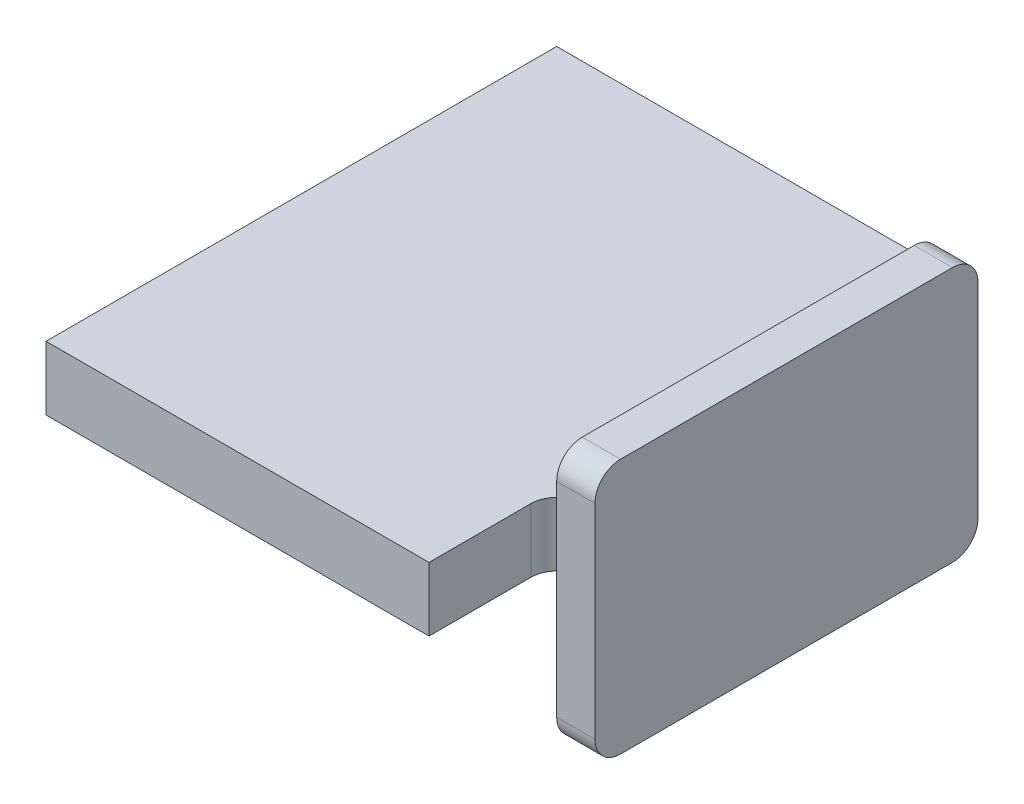
ISO-10303-21;
HEADER;
FILE_DESCRIPTION(('STEP AP214'),'2;1');
FILE_NAME('part.step','',(''),(''),'','','');
FILE_SCHEMA(('AUTOMOTIVE_DESIGN { 1 0 10303 214 1 1 1 1 }'));
ENDSEC;
DATA;
#1=APPLICATION_CONTEXT('core data for automotive mechanical design processes');
#2=APPLICATION_PROTOCOL_DEFINITION('international standard','automotive_design',2000,#1);
#3=PRODUCT_CONTEXT('',#1,'mechanical');
#4=PRODUCT('Part','Part','',(#3));
#5=PRODUCT_RELATED_PRODUCT_CATEGORY('part','',(#4));
#6=PRODUCT_DEFINITION_FORMATION('','',#4);
#7=PRODUCT_DEFINITION_CONTEXT('part definition',#1,'design');
#8=PRODUCT_DEFINITION('design','',#6,#7);
#9=PRODUCT_DEFINITION_SHAPE('','',#8);
#10=(LENGTH_UNIT() NAMED_UNIT(*) SI_UNIT(.MILLI.,.METRE.));
#11=(NAMED_UNIT(*) PLANE_ANGLE_UNIT() SI_UNIT($,.RADIAN.));
#12=(NAMED_UNIT(*) SI_UNIT($,.STERADIAN.) SOLID_ANGLE_UNIT());
#13=UNCERTAINTY_MEASURE_WITH_UNIT(LENGTH_MEASURE(1.E-05),#10,'distance_accuracy_value','');
#14=(GEOMETRIC_REPRESENTATION_CONTEXT(3) GLOBAL_UNCERTAINTY_ASSIGNED_CONTEXT((#13)) GLOBAL_UNIT_ASSIGNED_CONTEXT((#10,
#11,#12)) REPRESENTATION_CONTEXT('',''));
#15=CARTESIAN_POINT('',(0.,0.,0.));
#16=DIRECTION('',(0.,0.,1.));
#17=DIRECTION('',(1.,0.,0.));
#18=AXIS2_PLACEMENT_3D('',#15,#16,#17);
#19=CARTESIAN_POINT('',(-3.,2.5,12.));
#20=DIRECTION('',(0.,-1.,0.));
#21=DIRECTION('',(0.,0.,-1.));
#22=AXIS2_PLACEMENT_3D('',#19,#20,#21);
#23=CYLINDRICAL_SURFACE('',#22,2.);
#24=DIRECTION('',(0.,-1.,0.));
#25=VECTOR('',#24,1.);
#26=CARTESIAN_POINT('',(-3.,2.5,10.));
#27=LINE('',#26,#25);
#28=CARTESIAN_POINT('',(-3.,2.5,10.));
#29=VERTEX_POINT('',#28);
#30=CARTESIAN_POINT('',(-3.,-2.5,10.));
#31=VERTEX_POINT('',#30);
#32=EDGE_CURVE('E280',#29,#31,#27,.T.);
#33=ORIENTED_EDGE('',*,*,#32,.F.);
#34=CARTESIAN_POINT('',(-3.,2.5,12.));
#35=DIRECTION('',(0.,1.,0.));
#36=DIRECTION('',(0.,0.,1.));
#37=AXIS2_PLACEMENT_3D('',#34,#35,#36);
#38=CIRCLE('',#37,2.);
#39=CARTESIAN_POINT('',(-5.,2.5,12.));
#40=VERTEX_POINT('',#39);
#41=EDGE_CURVE('E42',#29,#40,#38,.T.);
#42=ORIENTED_EDGE('',*,*,#41,.T.);
#43=DIRECTION('',(0.,-1.,0.));
#44=VECTOR('',#43,1.);
#45=CARTESIAN_POINT('',(-5.,2.5,12.));
#46=LINE('',#45,#44);
#47=CARTESIAN_POINT('',(-5.,-2.5,12.));
#48=VERTEX_POINT('',#47);
#49=EDGE_CURVE('E283',#48,#40,#46,.F.);
#50=ORIENTED_EDGE('',*,*,#49,.F.);
#51=CARTESIAN_POINT('',(-3.,-2.5,12.));
#52=DIRECTION('',(0.,-1.,0.));
#53=DIRECTION('',(0.,0.,-1.));
#54=AXIS2_PLACEMENT_3D('',#51,#52,#53);
#55=CIRCLE('',#54,2.);
#56=EDGE_CURVE('E11',#48,#31,#55,.T.);
#57=ORIENTED_EDGE('',*,*,#56,.T.);
#58=EDGE_LOOP('',(#33,#42,#50,#57));
#59=FACE_BOUND('',#58,.T.);
#60=ADVANCED_FACE('F35',(#59),#23,.F.);
#61=CARTESIAN_POINT('',(-3.,2.5,-12.));
#62=DIRECTION('',(0.,-1.,0.));
#63=DIRECTION('',(0.,0.,-1.));
#64=AXIS2_PLACEMENT_3D('',#61,#62,#63);
#65=CYLINDRICAL_SURFACE('',#64,2.);
#66=DIRECTION('',(0.,-1.,0.));
#67=VECTOR('',#66,1.);
#68=CARTESIAN_POINT('',(-5.,2.5,-12.));
#69=LINE('',#68,#67);
#70=CARTESIAN_POINT('',(-5.,2.5,-12.));
#71=VERTEX_POINT('',#70);
#72=CARTESIAN_POINT('',(-5.,-2.5,-12.));
#73=VERTEX_POINT('',#72);
#74=EDGE_CURVE('E270',#71,#73,#69,.T.);
#75=ORIENTED_EDGE('',*,*,#74,.F.);
#76=CARTESIAN_POINT('',(-3.,2.5,-12.));
#77=DIRECTION('',(0.,1.,0.));
#78=DIRECTION('',(0.,0.,1.));
#79=AXIS2_PLACEMENT_3D('',#76,#77,#78);
#80=CIRCLE('',#79,2.);
#81=CARTESIAN_POINT('',(-3.,2.5,-10.));
#82=VERTEX_POINT('',#81);
#83=EDGE_CURVE('E276',#71,#82,#80,.T.);
#84=ORIENTED_EDGE('',*,*,#83,.T.);
#85=DIRECTION('',(0.,-1.,0.));
#86=VECTOR('',#85,1.);
#87=CARTESIAN_POINT('',(-3.,2.5,-10.));
#88=LINE('',#87,#86);
#89=CARTESIAN_POINT('',(-3.,-2.5,-10.));
#90=VERTEX_POINT('',#89);
#91=EDGE_CURVE('E273',#90,#82,#88,.F.);
#92=ORIENTED_EDGE('',*,*,#91,.F.);
#93=CARTESIAN_POINT('',(-3.,-2.5,-12.));
#94=DIRECTION('',(0.,-1.,0.));
#95=DIRECTION('',(0.,0.,-1.));
#96=AXIS2_PLACEMENT_3D('',#93,#94,#95);
#97=CIRCLE('',#96,2.);
#98=EDGE_CURVE('E278',#90,#73,#97,.T.);
#99=ORIENTED_EDGE('',*,*,#98,.T.);
#100=EDGE_LOOP('',(#75,#84,#92,#99));
#101=FACE_BOUND('',#100,.T.);
#102=ADVANCED_FACE('F312',(#101),#65,.F.);
#103=CARTESIAN_POINT('',(-35.,2.5,-10.));
#104=DIRECTION('',(0.,0.,-1.));
#105=DIRECTION('',(-1.,0.,0.));
#106=AXIS2_PLACEMENT_3D('',#103,#104,#105);
#107=PLANE('',#106);
#108=DIRECTION('',(1.,0.,0.));
#109=VECTOR('',#108,1.);
#110=CARTESIAN_POINT('',(-35.,-2.5,-10.));
#111=LINE('',#110,#109);
#112=CARTESIAN_POINT('',(0.,-2.5,-10.));
#113=VERTEX_POINT('',#112);
#114=EDGE_CURVE('E221',#90,#113,#111,.T.);
#115=ORIENTED_EDGE('',*,*,#114,.F.);
#116=ORIENTED_EDGE('',*,*,#91,.T.);
#117=DIRECTION('',(1.,0.,0.));
#118=VECTOR('',#117,1.);
#119=CARTESIAN_POINT('',(-35.,2.5,-10.));
#120=LINE('',#119,#118);
#121=CARTESIAN_POINT('',(0.,2.5,-10.));
#122=VERTEX_POINT('',#121);
#123=EDGE_CURVE('E210',#82,#122,#120,.T.);
#124=ORIENTED_EDGE('',*,*,#123,.T.);
#125=DIRECTION('',(0.,1.,0.));
#126=VECTOR('',#125,1.);
#127=CARTESIAN_POINT('',(0.,2.5,-10.));
#128=LINE('',#127,#126);
#129=EDGE_CURVE('E201',#113,#122,#128,.T.);
#130=ORIENTED_EDGE('',*,*,#129,.F.);
#131=EDGE_LOOP('',(#115,#116,#124,#130));
#132=FACE_BOUND('',#131,.T.);
#133=ADVANCED_FACE('F317',(#132),#107,.T.);
#134=CARTESIAN_POINT('',(-35.,2.5,10.));
#135=DIRECTION('',(0.,0.,1.));
#136=DIRECTION('',(1.,0.,0.));
#137=AXIS2_PLACEMENT_3D('',#134,#135,#136);
#138=PLANE('',#137);
#139=DIRECTION('',(1.,0.,0.));
#140=VECTOR('',#139,1.);
#141=CARTESIAN_POINT('',(-35.,2.5,10.));
#142=LINE('',#141,#140);
#143=CARTESIAN_POINT('',(0.,2.5,10.));
#144=VERTEX_POINT('',#143);
#145=EDGE_CURVE('E226',#29,#144,#142,.T.);
#146=ORIENTED_EDGE('',*,*,#145,.F.);
#147=ORIENTED_EDGE('',*,*,#32,.T.);
#148=DIRECTION('',(1.,0.,0.));
#149=VECTOR('',#148,1.);
#150=CARTESIAN_POINT('',(-35.,-2.5,10.));
#151=LINE('',#150,#149);
#152=CARTESIAN_POINT('',(0.,-2.5,10.));
#153=VERTEX_POINT('',#152);
#154=EDGE_CURVE('E224',#31,#153,#151,.T.);
#155=ORIENTED_EDGE('',*,*,#154,.T.);
#156=DIRECTION('',(0.,-1.,0.));
#157=VECTOR('',#156,1.);
#158=CARTESIAN_POINT('',(0.,2.5,10.));
#159=LINE('',#158,#157);
#160=EDGE_CURVE('E216',#144,#153,#159,.T.);
#161=ORIENTED_EDGE('',*,*,#160,.F.);
#162=EDGE_LOOP('',(#146,#147,#155,#161));
#163=FACE_BOUND('',#162,.T.);
#164=ADVANCED_FACE('F326',(#163),#138,.T.);
#165=CARTESIAN_POINT('',(3.,-8.,13.));
#166=DIRECTION('',(1.,0.,0.));
#167=DIRECTION('',(0.,0.,-1.));
#168=AXIS2_PLACEMENT_3D('',#165,#166,#167);
#169=CYLINDRICAL_SURFACE('',#168,2.);
#170=DIRECTION('',(1.,0.,0.));
#171=VECTOR('',#170,1.);
#172=CARTESIAN_POINT('',(3.,-8.,15.));
#173=LINE('',#172,#171);
#174=CARTESIAN_POINT('',(0.,-8.,15.));
#175=VERTEX_POINT('',#174);
#176=CARTESIAN_POINT('',(3.,-8.,15.));
#177=VERTEX_POINT('',#176);
#178=EDGE_CURVE('E260',#175,#177,#173,.T.);
#179=ORIENTED_EDGE('',*,*,#178,.F.);
#180=CARTESIAN_POINT('',(0.,-8.,13.));
#181=DIRECTION('',(1.,0.,0.));
#182=DIRECTION('',(0.,0.,-1.));
#183=AXIS2_PLACEMENT_3D('',#180,#181,#182);
#184=CIRCLE('',#183,2.);
#185=CARTESIAN_POINT('',(0.,-10.,13.));
#186=VERTEX_POINT('',#185);
#187=EDGE_CURVE('E266',#186,#175,#184,.F.);
#188=ORIENTED_EDGE('',*,*,#187,.F.);
#189=DIRECTION('',(1.,0.,0.));
#190=VECTOR('',#189,1.);
#191=CARTESIAN_POINT('',(3.,-10.,13.));
#192=LINE('',#191,#190);
#193=CARTESIAN_POINT('',(3.,-10.,13.));
#194=VERTEX_POINT('',#193);
#195=EDGE_CURVE('E263',#194,#186,#192,.F.);
#196=ORIENTED_EDGE('',*,*,#195,.F.);
#197=CARTESIAN_POINT('',(3.,-8.,13.));
#198=DIRECTION('',(1.,0.,0.));
#199=DIRECTION('',(0.,0.,-1.));
#200=AXIS2_PLACEMENT_3D('',#197,#198,#199);
#201=CIRCLE('',#200,2.);
#202=EDGE_CURVE('E268',#177,#194,#201,.T.);
#203=ORIENTED_EDGE('',*,*,#202,.F.);
#204=EDGE_LOOP('',(#179,#188,#196,#203));
#205=FACE_BOUND('',#204,.T.);
#206=ADVANCED_FACE('F336',(#205),#169,.T.);
#207=CARTESIAN_POINT('',(3.,-8.,-13.));
#208=DIRECTION('',(1.,0.,0.));
#209=DIRECTION('',(0.,0.,-1.));
#210=AXIS2_PLACEMENT_3D('',#207,#208,#209);
#211=CYLINDRICAL_SURFACE('',#210,2.);
#212=DIRECTION('',(1.,0.,0.));
#213=VECTOR('',#212,1.);
#214=CARTESIAN_POINT('',(3.,-10.,-13.));
#215=LINE('',#214,#213);
#216=CARTESIAN_POINT('',(0.,-10.,-13.));
#217=VERTEX_POINT('',#216);
#218=CARTESIAN_POINT('',(3.,-10.,-13.));
#219=VERTEX_POINT('',#218);
#220=EDGE_CURVE('E249',#217,#219,#215,.T.);
#221=ORIENTED_EDGE('',*,*,#220,.F.);
#222=CARTESIAN_POINT('',(0.,-8.,-13.));
#223=DIRECTION('',(1.,0.,0.));
#224=DIRECTION('',(0.,0.,-1.));
#225=AXIS2_PLACEMENT_3D('',#222,#223,#224);
#226=CIRCLE('',#225,2.);
#227=CARTESIAN_POINT('',(0.,-8.,-15.));
#228=VERTEX_POINT('',#227);
#229=EDGE_CURVE('E255',#228,#217,#226,.F.);
#230=ORIENTED_EDGE('',*,*,#229,.F.);
#231=DIRECTION('',(1.,0.,0.));
#232=VECTOR('',#231,1.);
#233=CARTESIAN_POINT('',(3.,-8.,-15.));
#234=LINE('',#233,#232);
#235=CARTESIAN_POINT('',(3.,-8.,-15.));
#236=VERTEX_POINT('',#235);
#237=EDGE_CURVE('E252',#236,#228,#234,.F.);
#238=ORIENTED_EDGE('',*,*,#237,.F.);
#239=CARTESIAN_POINT('',(3.,-8.,-13.));
#240=DIRECTION('',(1.,0.,0.));
#241=DIRECTION('',(0.,0.,-1.));
#242=AXIS2_PLACEMENT_3D('',#239,#240,#241);
#243=CIRCLE('',#242,2.);
#244=EDGE_CURVE('E258',#219,#236,#243,.T.);
#245=ORIENTED_EDGE('',*,*,#244,.F.);
#246=EDGE_LOOP('',(#221,#230,#238,#245));
#247=FACE_BOUND('',#246,.T.);
#248=ADVANCED_FACE('F339',(#247),#211,.T.);
#249=CARTESIAN_POINT('',(3.,8.,13.));
#250=DIRECTION('',(-1.,0.,0.));
#251=DIRECTION('',(0.,0.,1.));
#252=AXIS2_PLACEMENT_3D('',#249,#250,#251);
#253=CYLINDRICAL_SURFACE('',#252,2.);
#254=DIRECTION('',(-1.,0.,0.));
#255=VECTOR('',#254,1.);
#256=CARTESIAN_POINT('',(3.,8.,15.));
#257=LINE('',#256,#255);
#258=CARTESIAN_POINT('',(3.,8.,15.));
#259=VERTEX_POINT('',#258);
#260=CARTESIAN_POINT('',(0.,8.,15.));
#261=VERTEX_POINT('',#260);
#262=EDGE_CURVE('E239',#259,#261,#257,.T.);
#263=ORIENTED_EDGE('',*,*,#262,.F.);
#264=CARTESIAN_POINT('',(3.,8.,13.));
#265=DIRECTION('',(1.,0.,0.));
#266=DIRECTION('',(0.,0.,-1.));
#267=AXIS2_PLACEMENT_3D('',#264,#265,#266);
#268=CIRCLE('',#267,2.);
#269=CARTESIAN_POINT('',(3.,10.,13.));
#270=VERTEX_POINT('',#269);
#271=EDGE_CURVE('E245',#270,#259,#268,.T.);
#272=ORIENTED_EDGE('',*,*,#271,.F.);
#273=DIRECTION('',(-1.,0.,0.));
#274=VECTOR('',#273,1.);
#275=CARTESIAN_POINT('',(3.,10.,13.));
#276=LINE('',#275,#274);
#277=CARTESIAN_POINT('',(0.,10.,13.));
#278=VERTEX_POINT('',#277);
#279=EDGE_CURVE('E242',#278,#270,#276,.F.);
#280=ORIENTED_EDGE('',*,*,#279,.F.);
#281=CARTESIAN_POINT('',(0.,8.,13.));
#282=DIRECTION('',(1.,0.,0.));
#283=DIRECTION('',(0.,0.,-1.));
#284=AXIS2_PLACEMENT_3D('',#281,#282,#283);
#285=CIRCLE('',#284,2.);
#286=EDGE_CURVE('E247',#261,#278,#285,.F.);
#287=ORIENTED_EDGE('',*,*,#286,.F.);
#288=EDGE_LOOP('',(#263,#272,#280,#287));
#289=FACE_BOUND('',#288,.T.);
#290=ADVANCED_FACE('F343',(#289),#253,.T.);
#291=CARTESIAN_POINT('',(3.,8.,-13.));
#292=DIRECTION('',(1.,0.,0.));
#293=DIRECTION('',(0.,0.,-1.));
#294=AXIS2_PLACEMENT_3D('',#291,#292,#293);
#295=CYLINDRICAL_SURFACE('',#294,2.);
#296=DIRECTION('',(1.,0.,0.));
#297=VECTOR('',#296,1.);
#298=CARTESIAN_POINT('',(3.,8.,-15.));
#299=LINE('',#298,#297);
#300=CARTESIAN_POINT('',(0.,8.,-15.));
#301=VERTEX_POINT('',#300);
#302=CARTESIAN_POINT('',(3.,8.,-15.));
#303=VERTEX_POINT('',#302);
#304=EDGE_CURVE('E223',#301,#303,#299,.T.);
#305=ORIENTED_EDGE('',*,*,#304,.F.);
#306=CARTESIAN_POINT('',(0.,8.,-13.));
#307=DIRECTION('',(1.,0.,0.));
#308=DIRECTION('',(0.,0.,-1.));
#309=AXIS2_PLACEMENT_3D('',#306,#307,#308);
#310=CIRCLE('',#309,2.);
#311=CARTESIAN_POINT('',(0.,10.,-13.));
#312=VERTEX_POINT('',#311);
#313=EDGE_CURVE('E234',#312,#301,#310,.F.);
#314=ORIENTED_EDGE('',*,*,#313,.F.);
#315=DIRECTION('',(1.,0.,0.));
#316=VECTOR('',#315,1.);
#317=CARTESIAN_POINT('',(3.,10.,-13.));
#318=LINE('',#317,#316);
#319=CARTESIAN_POINT('',(3.,10.,-13.));
#320=VERTEX_POINT('',#319);
#321=EDGE_CURVE('E231',#320,#312,#318,.F.);
#322=ORIENTED_EDGE('',*,*,#321,.F.);
#323=CARTESIAN_POINT('',(3.,8.,-13.));
#324=DIRECTION('',(1.,0.,0.));
#325=DIRECTION('',(0.,0.,-1.));
#326=AXIS2_PLACEMENT_3D('',#323,#324,#325);
#327=CIRCLE('',#326,2.);
#328=EDGE_CURVE('E237',#303,#320,#327,.T.);
#329=ORIENTED_EDGE('',*,*,#328,.F.);
#330=EDGE_LOOP('',(#305,#314,#322,#329));
#331=FACE_BOUND('',#330,.T.);
#332=ADVANCED_FACE('F347',(#331),#295,.T.);
#333=CARTESIAN_POINT('',(-35.,-2.5,10.));
#334=DIRECTION('',(0.,-1.,0.));
#335=DIRECTION('',(0.,0.,-1.));
#336=AXIS2_PLACEMENT_3D('',#333,#334,#335);
#337=PLANE('',#336);
#338=ORIENTED_EDGE('',*,*,#98,.F.);
#339=ORIENTED_EDGE('',*,*,#114,.T.);
#340=DIRECTION('',(0.,0.,-1.));
#341=VECTOR('',#340,1.);
#342=CARTESIAN_POINT('',(0.,-2.5,10.));
#343=LINE('',#342,#341);
#344=EDGE_CURVE('E169',#153,#113,#343,.T.);
#345=ORIENTED_EDGE('',*,*,#344,.F.);
#346=ORIENTED_EDGE('',*,*,#154,.F.);
#347=ORIENTED_EDGE('',*,*,#56,.F.);
#348=DIRECTION('',(0.,0.,-1.));
#349=VECTOR('',#348,1.);
#350=CARTESIAN_POINT('',(-5.,-2.5,-20.));
#351=LINE('',#350,#349);
#352=CARTESIAN_POINT('',(-5.,-2.5,20.));
#353=VERTEX_POINT('',#352);
#354=EDGE_CURVE('E288',#353,#48,#351,.T.);
#355=ORIENTED_EDGE('',*,*,#354,.F.);
#356=DIRECTION('',(1.,0.,0.));
#357=VECTOR('',#356,1.);
#358=CARTESIAN_POINT('',(-35.,-2.5,20.));
#359=LINE('',#358,#357);
#360=CARTESIAN_POINT('',(-35.,-2.5,20.));
#361=VERTEX_POINT('',#360);
#362=EDGE_CURVE('E293',#361,#353,#359,.T.);
#363=ORIENTED_EDGE('',*,*,#362,.F.);
#364=DIRECTION('',(0.,0.,-1.));
#365=VECTOR('',#364,1.);
#366=CARTESIAN_POINT('',(-35.,-2.5,10.));
#367=LINE('',#366,#365);
#368=CARTESIAN_POINT('',(-35.,-2.5,-20.));
#369=VERTEX_POINT('',#368);
#370=EDGE_CURVE('E168',#361,#369,#367,.T.);
#371=ORIENTED_EDGE('',*,*,#370,.T.);
#372=DIRECTION('',(-1.,0.,0.));
#373=VECTOR('',#372,1.);
#374=CARTESIAN_POINT('',(-35.,-2.5,-20.));
#375=LINE('',#374,#373);
#376=CARTESIAN_POINT('',(-5.,-2.5,-20.));
#377=VERTEX_POINT('',#376);
#378=EDGE_CURVE('E179',#377,#369,#375,.T.);
#379=ORIENTED_EDGE('',*,*,#378,.F.);
#380=EDGE_CURVE('E295',#73,#377,#351,.T.);
#381=ORIENTED_EDGE('',*,*,#380,.F.);
#382=EDGE_LOOP('',(#338,#339,#345,#346,#347,#355,#363,#371,#379,#381));
#383=FACE_BOUND('',#382,.T.);
#384=ADVANCED_FACE('F307',(#383),#337,.T.);
#385=CARTESIAN_POINT('',(-35.,2.5,10.));
#386=DIRECTION('',(0.,1.,0.));
#387=DIRECTION('',(0.,0.,1.));
#388=AXIS2_PLACEMENT_3D('',#385,#386,#387);
#389=PLANE('',#388);
#390=ORIENTED_EDGE('',*,*,#41,.F.);
#391=ORIENTED_EDGE('',*,*,#145,.T.);
#392=DIRECTION('',(0.,0.,1.));
#393=VECTOR('',#392,1.);
#394=CARTESIAN_POINT('',(0.,2.5,10.));
#395=LINE('',#394,#393);
#396=EDGE_CURVE('E213',#122,#144,#395,.T.);
#397=ORIENTED_EDGE('',*,*,#396,.F.);
#398=ORIENTED_EDGE('',*,*,#123,.F.);
#399=ORIENTED_EDGE('',*,*,#83,.F.);
#400=DIRECTION('',(0.,0.,-1.));
#401=VECTOR('',#400,1.);
#402=CARTESIAN_POINT('',(-5.,2.5,-20.));
#403=LINE('',#402,#401);
#404=CARTESIAN_POINT('',(-5.,2.5,-20.));
#405=VERTEX_POINT('',#404);
#406=EDGE_CURVE('E178',#71,#405,#403,.T.);
#407=ORIENTED_EDGE('',*,*,#406,.T.);
#408=DIRECTION('',(-1.,0.,0.));
#409=VECTOR('',#408,1.);
#410=CARTESIAN_POINT('',(-35.,2.5,-20.));
#411=LINE('',#410,#409);
#412=CARTESIAN_POINT('',(-35.,2.5,-20.));
#413=VERTEX_POINT('',#412);
#414=EDGE_CURVE('E163',#405,#413,#411,.T.);
#415=ORIENTED_EDGE('',*,*,#414,.T.);
#416=DIRECTION('',(0.,0.,1.));
#417=VECTOR('',#416,1.);
#418=CARTESIAN_POINT('',(-35.,2.5,10.));
#419=LINE('',#418,#417);
#420=CARTESIAN_POINT('',(-35.,2.5,20.));
#421=VERTEX_POINT('',#420);
#422=EDGE_CURVE('E156',#413,#421,#419,.T.);
#423=ORIENTED_EDGE('',*,*,#422,.T.);
#424=DIRECTION('',(1.,0.,0.));
#425=VECTOR('',#424,1.);
#426=CARTESIAN_POINT('',(-35.,2.5,20.));
#427=LINE('',#426,#425);
#428=CARTESIAN_POINT('',(-5.,2.5,20.));
#429=VERTEX_POINT('',#428);
#430=EDGE_CURVE('E160',#421,#429,#427,.T.);
#431=ORIENTED_EDGE('',*,*,#430,.T.);
#432=EDGE_CURVE('E287',#429,#40,#403,.T.);
#433=ORIENTED_EDGE('',*,*,#432,.T.);
#434=EDGE_LOOP('',(#390,#391,#397,#398,#399,#407,#415,#423,#431,#433));
#435=FACE_BOUND('',#434,.T.);
#436=ADVANCED_FACE('F158',(#435),#389,.T.);
#437=CARTESIAN_POINT('',(-35.,0.,0.));
#438=DIRECTION('',(1.,0.,0.));
#439=DIRECTION('',(0.,0.,-1.));
#440=AXIS2_PLACEMENT_3D('',#437,#438,#439);
#441=PLANE('',#440);
#442=ORIENTED_EDGE('',*,*,#422,.F.);
#443=DIRECTION('',(0.,-1.,0.));
#444=VECTOR('',#443,1.);
#445=CARTESIAN_POINT('',(-35.,2.5,-20.));
#446=LINE('',#445,#444);
#447=EDGE_CURVE('E290',#413,#369,#446,.T.);
#448=ORIENTED_EDGE('',*,*,#447,.T.);
#449=ORIENTED_EDGE('',*,*,#370,.F.);
#450=DIRECTION('',(0.,-1.,0.));
#451=VECTOR('',#450,1.);
#452=CARTESIAN_POINT('',(-35.,2.5,20.));
#453=LINE('',#452,#451);
#454=EDGE_CURVE('E174',#421,#361,#453,.T.);
#455=ORIENTED_EDGE('',*,*,#454,.F.);
#456=EDGE_LOOP('',(#442,#448,#449,#455));
#457=FACE_BOUND('',#456,.T.);
#458=ADVANCED_FACE('F181',(#457),#441,.F.);
#459=CARTESIAN_POINT('',(3.,10.,-15.));
#460=DIRECTION('',(0.,0.,1.));
#461=DIRECTION('',(1.,0.,0.));
#462=AXIS2_PLACEMENT_3D('',#459,#460,#461);
#463=PLANE('',#462);
#464=DIRECTION('',(0.,1.,0.));
#465=VECTOR('',#464,1.);
#466=CARTESIAN_POINT('',(3.,10.,-15.));
#467=LINE('',#466,#465);
#468=EDGE_CURVE('E191',#236,#303,#467,.T.);
#469=ORIENTED_EDGE('',*,*,#468,.F.);
#470=ORIENTED_EDGE('',*,*,#237,.T.);
#471=DIRECTION('',(0.,1.,0.));
#472=VECTOR('',#471,1.);
#473=CARTESIAN_POINT('',(0.,10.,-15.));
#474=LINE('',#473,#472);
#475=EDGE_CURVE('E183',#228,#301,#474,.T.);
#476=ORIENTED_EDGE('',*,*,#475,.T.);
#477=ORIENTED_EDGE('',*,*,#304,.T.);
#478=EDGE_LOOP('',(#469,#470,#476,#477));
#479=FACE_BOUND('',#478,.T.);
#480=ADVANCED_FACE('F360',(#479),#463,.F.);
#481=CARTESIAN_POINT('',(3.,10.,15.));
#482=DIRECTION('',(0.,-1.,0.));
#483=DIRECTION('',(0.,0.,-1.));
#484=AXIS2_PLACEMENT_3D('',#481,#482,#483);
#485=PLANE('',#484);
#486=DIRECTION('',(0.,0.,1.));
#487=VECTOR('',#486,1.);
#488=CARTESIAN_POINT('',(0.,10.,15.));
#489=LINE('',#488,#487);
#490=EDGE_CURVE('E185',#312,#278,#489,.T.);
#491=ORIENTED_EDGE('',*,*,#490,.T.);
#492=ORIENTED_EDGE('',*,*,#279,.T.);
#493=DIRECTION('',(0.,0.,1.));
#494=VECTOR('',#493,1.);
#495=CARTESIAN_POINT('',(3.,10.,15.));
#496=LINE('',#495,#494);
#497=EDGE_CURVE('E193',#320,#270,#496,.T.);
#498=ORIENTED_EDGE('',*,*,#497,.F.);
#499=ORIENTED_EDGE('',*,*,#321,.T.);
#500=EDGE_LOOP('',(#491,#492,#498,#499));
#501=FACE_BOUND('',#500,.T.);
#502=ADVANCED_FACE('F363',(#501),#485,.F.);
#503=CARTESIAN_POINT('',(3.,10.,15.));
#504=DIRECTION('',(0.,0.,-1.));
#505=DIRECTION('',(0.,1.,0.));
#506=AXIS2_PLACEMENT_3D('',#503,#504,#505);
#507=PLANE('',#506);
#508=DIRECTION('',(0.,-1.,0.));
#509=VECTOR('',#508,1.);
#510=CARTESIAN_POINT('',(0.,10.,15.));
#511=LINE('',#510,#509);
#512=EDGE_CURVE('E205',#261,#175,#511,.T.);
#513=ORIENTED_EDGE('',*,*,#512,.T.);
#514=ORIENTED_EDGE('',*,*,#178,.T.);
#515=DIRECTION('',(0.,-1.,0.));
#516=VECTOR('',#515,1.);
#517=CARTESIAN_POINT('',(3.,10.,15.));
#518=LINE('',#517,#516);
#519=EDGE_CURVE('E197',#259,#177,#518,.T.);
#520=ORIENTED_EDGE('',*,*,#519,.F.);
#521=ORIENTED_EDGE('',*,*,#262,.T.);
#522=EDGE_LOOP('',(#513,#514,#520,#521));
#523=FACE_BOUND('',#522,.T.);
#524=ADVANCED_FACE('F367',(#523),#507,.F.);
#525=CARTESIAN_POINT('',(3.,-10.,15.));
#526=DIRECTION('',(0.,1.,0.));
#527=DIRECTION('',(0.,0.,1.));
#528=AXIS2_PLACEMENT_3D('',#525,#526,#527);
#529=PLANE('',#528);
#530=DIRECTION('',(0.,0.,-1.));
#531=VECTOR('',#530,1.);
#532=CARTESIAN_POINT('',(3.,-10.,15.));
#533=LINE('',#532,#531);
#534=EDGE_CURVE('E200',#194,#219,#533,.T.);
#535=ORIENTED_EDGE('',*,*,#534,.F.);
#536=ORIENTED_EDGE('',*,*,#195,.T.);
#537=DIRECTION('',(0.,0.,-1.));
#538=VECTOR('',#537,1.);
#539=CARTESIAN_POINT('',(0.,-10.,15.));
#540=LINE('',#539,#538);
#541=EDGE_CURVE('E194',#186,#217,#540,.T.);
#542=ORIENTED_EDGE('',*,*,#541,.T.);
#543=ORIENTED_EDGE('',*,*,#220,.T.);
#544=EDGE_LOOP('',(#535,#536,#542,#543));
#545=FACE_BOUND('',#544,.T.);
#546=ADVANCED_FACE('F371',(#545),#529,.F.);
#547=CARTESIAN_POINT('',(3.,0.,0.));
#548=DIRECTION('',(1.,0.,0.));
#549=DIRECTION('',(0.,0.,-1.));
#550=AXIS2_PLACEMENT_3D('',#547,#548,#549);
#551=PLANE('',#550);
#552=ORIENTED_EDGE('',*,*,#519,.T.);
#553=ORIENTED_EDGE('',*,*,#202,.T.);
#554=ORIENTED_EDGE('',*,*,#534,.T.);
#555=ORIENTED_EDGE('',*,*,#244,.T.);
#556=ORIENTED_EDGE('',*,*,#468,.T.);
#557=ORIENTED_EDGE('',*,*,#328,.T.);
#558=ORIENTED_EDGE('',*,*,#497,.T.);
#559=ORIENTED_EDGE('',*,*,#271,.T.);
#560=EDGE_LOOP('',(#552,#553,#554,#555,#556,#557,#558,#559));
#561=FACE_BOUND('',#560,.T.);
#562=ADVANCED_FACE('F375',(#561),#551,.T.);
#563=CARTESIAN_POINT('',(0.,0.,0.));
#564=DIRECTION('',(1.,0.,0.));
#565=DIRECTION('',(0.,0.,-1.));
#566=AXIS2_PLACEMENT_3D('',#563,#564,#565);
#567=PLANE('',#566);
#568=ORIENTED_EDGE('',*,*,#129,.T.);
#569=ORIENTED_EDGE('',*,*,#396,.T.);
#570=ORIENTED_EDGE('',*,*,#160,.T.);
#571=ORIENTED_EDGE('',*,*,#344,.T.);
#572=EDGE_LOOP('',(#568,#569,#570,#571));
#573=FACE_BOUND('',#572,.T.);
#574=ORIENTED_EDGE('',*,*,#541,.F.);
#575=ORIENTED_EDGE('',*,*,#187,.T.);
#576=ORIENTED_EDGE('',*,*,#512,.F.);
#577=ORIENTED_EDGE('',*,*,#286,.T.);
#578=ORIENTED_EDGE('',*,*,#490,.F.);
#579=ORIENTED_EDGE('',*,*,#313,.T.);
#580=ORIENTED_EDGE('',*,*,#475,.F.);
#581=ORIENTED_EDGE('',*,*,#229,.T.);
#582=EDGE_LOOP('',(#574,#575,#576,#577,#578,#579,#580,#581));
#583=FACE_BOUND('',#582,.T.);
#584=ADVANCED_FACE('F321',(#573,#583),#567,.F.);
#585=CARTESIAN_POINT('',(-35.,2.5,20.));
#586=DIRECTION('',(0.,0.,-1.));
#587=DIRECTION('',(-1.,0.,0.));
#588=AXIS2_PLACEMENT_3D('',#585,#586,#587);
#589=PLANE('',#588);
#590=ORIENTED_EDGE('',*,*,#362,.T.);
#591=DIRECTION('',(0.,-1.,0.));
#592=VECTOR('',#591,1.);
#593=CARTESIAN_POINT('',(-5.,2.5,20.));
#594=LINE('',#593,#592);
#595=EDGE_CURVE('E176',#429,#353,#594,.T.);
#596=ORIENTED_EDGE('',*,*,#595,.F.);
#597=ORIENTED_EDGE('',*,*,#430,.F.);
#598=ORIENTED_EDGE('',*,*,#454,.T.);
#599=EDGE_LOOP('',(#590,#596,#597,#598));
#600=FACE_BOUND('',#599,.T.);
#601=ADVANCED_FACE('F173',(#600),#589,.F.);
#602=CARTESIAN_POINT('',(-5.,2.5,-20.));
#603=DIRECTION('',(-1.,0.,0.));
#604=DIRECTION('',(0.,0.,1.));
#605=AXIS2_PLACEMENT_3D('',#602,#603,#604);
#606=PLANE('',#605);
#607=ORIENTED_EDGE('',*,*,#354,.T.);
#608=ORIENTED_EDGE('',*,*,#49,.T.);
#609=ORIENTED_EDGE('',*,*,#432,.F.);
#610=ORIENTED_EDGE('',*,*,#595,.T.);
#611=EDGE_LOOP('',(#607,#608,#609,#610));
#612=FACE_BOUND('',#611,.T.);
#613=ADVANCED_FACE('F286',(#612),#606,.F.);
#614=ORIENTED_EDGE('',*,*,#406,.F.);
#615=ORIENTED_EDGE('',*,*,#74,.T.);
#616=ORIENTED_EDGE('',*,*,#380,.T.);
#617=DIRECTION('',(0.,-1.,0.));
#618=VECTOR('',#617,1.);
#619=CARTESIAN_POINT('',(-5.,2.5,-20.));
#620=LINE('',#619,#618);
#621=EDGE_CURVE('E187',#405,#377,#620,.T.);
#622=ORIENTED_EDGE('',*,*,#621,.F.);
#623=EDGE_LOOP('',(#614,#615,#616,#622));
#624=FACE_BOUND('',#623,.T.);
#625=ADVANCED_FACE('F309',(#624),#606,.F.);
#626=CARTESIAN_POINT('',(-35.,2.5,-20.));
#627=DIRECTION('',(0.,0.,1.));
#628=DIRECTION('',(1.,0.,0.));
#629=AXIS2_PLACEMENT_3D('',#626,#627,#628);
#630=PLANE('',#629);
#631=ORIENTED_EDGE('',*,*,#378,.T.);
#632=ORIENTED_EDGE('',*,*,#447,.F.);
#633=ORIENTED_EDGE('',*,*,#414,.F.);
#634=ORIENTED_EDGE('',*,*,#621,.T.);
#635=EDGE_LOOP('',(#631,#632,#633,#634));
#636=FACE_BOUND('',#635,.T.);
#637=ADVANCED_FACE('F303',(#636),#630,.F.);
#638=CLOSED_SHELL('',(#60,#102,#133,#164,#206,#248,#290,#332,#384,#436,#458,#480,#502,#524,#546,
#562,#584,#601,#613,#625,#637));
#639=MANIFOLD_SOLID_BREP('B2',#638);
#640=ADVANCED_BREP_SHAPE_REPRESENTATION('',(#18,#639),#14);
#641=SHAPE_DEFINITION_REPRESENTATION(#9,#640);
ENDSEC;
END-ISO-10303-21;
